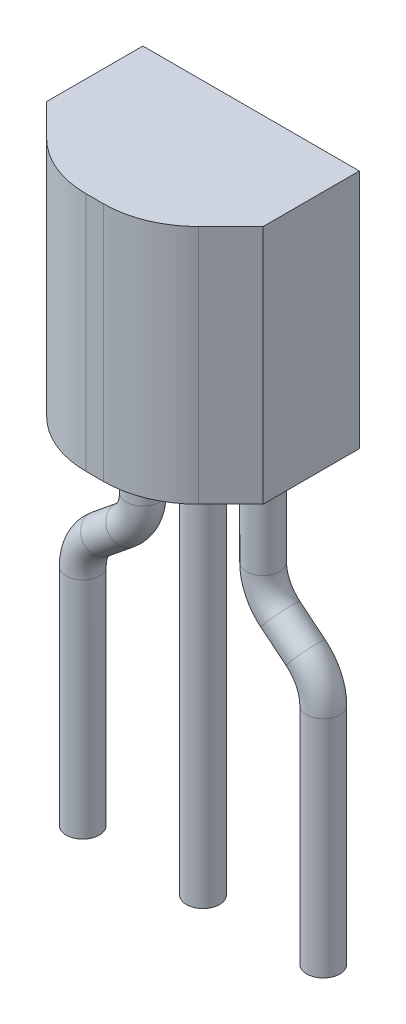
ISO-10303-21;
HEADER;
FILE_DESCRIPTION(('STEP AP214'),'2;1');
FILE_NAME('part.step','',(''),(''),'','','');
FILE_SCHEMA(('AUTOMOTIVE_DESIGN { 1 0 10303 214 1 1 1 1 }'));
ENDSEC;
DATA;
#1=APPLICATION_CONTEXT('core data for automotive mechanical design processes');
#2=APPLICATION_PROTOCOL_DEFINITION('international standard','automotive_design',2000,#1);
#3=PRODUCT_CONTEXT('',#1,'mechanical');
#4=PRODUCT('Part','Part','',(#3));
#5=PRODUCT_RELATED_PRODUCT_CATEGORY('part','',(#4));
#6=PRODUCT_DEFINITION_FORMATION('','',#4);
#7=PRODUCT_DEFINITION_CONTEXT('part definition',#1,'design');
#8=PRODUCT_DEFINITION('design','',#6,#7);
#9=PRODUCT_DEFINITION_SHAPE('','',#8);
#10=(LENGTH_UNIT() NAMED_UNIT(*) SI_UNIT(.MILLI.,.METRE.));
#11=(NAMED_UNIT(*) PLANE_ANGLE_UNIT() SI_UNIT($,.RADIAN.));
#12=(NAMED_UNIT(*) SI_UNIT($,.STERADIAN.) SOLID_ANGLE_UNIT());
#13=UNCERTAINTY_MEASURE_WITH_UNIT(LENGTH_MEASURE(1.E-05),#10,'distance_accuracy_value','');
#14=(GEOMETRIC_REPRESENTATION_CONTEXT(3) GLOBAL_UNCERTAINTY_ASSIGNED_CONTEXT((#13)) GLOBAL_UNIT_ASSIGNED_CONTEXT((#10,
#11,#12)) REPRESENTATION_CONTEXT('',''));
#15=CARTESIAN_POINT('',(0.,0.,0.));
#16=DIRECTION('',(0.,0.,1.));
#17=DIRECTION('',(1.,0.,0.));
#18=AXIS2_PLACEMENT_3D('',#15,#16,#17);
#19=CARTESIAN_POINT('',(-1.016,0.,-1.016));
#20=DIRECTION('',(0.,-1.,0.));
#21=DIRECTION('',(0.,0.,-1.));
#22=AXIS2_PLACEMENT_3D('',#19,#20,#21);
#23=PLANE('',#22);
#24=CARTESIAN_POINT('',(1.27,0.,0.));
#25=DIRECTION('',(0.,-1.,0.));
#26=DIRECTION('',(0.,0.,-1.));
#27=AXIS2_PLACEMENT_3D('',#24,#25,#26);
#28=CIRCLE('',#27,0.35);
#29=CARTESIAN_POINT('',(1.27,0.,-0.35));
#30=VERTEX_POINT('',#29);
#31=EDGE_CURVE('E211',#30,#30,#28,.T.);
#32=ORIENTED_EDGE('',*,*,#31,.F.);
#33=EDGE_LOOP('',(#32));
#34=FACE_BOUND('',#33,.T.);
#35=DIRECTION('',(0.707106781186547,0.,-0.707106781186547));
#36=VECTOR('',#35,1.);
#37=CARTESIAN_POINT('',(2.286,0.,2.286));
#38=LINE('',#37,#36);
#39=CARTESIAN_POINT('',(2.8717864376269,0.,1.70021356237309));
#40=VERTEX_POINT('',#39);
#41=CARTESIAN_POINT('',(3.556,0.,1.016));
#42=VERTEX_POINT('',#41);
#43=EDGE_CURVE('E181',#40,#42,#38,.T.);
#44=ORIENTED_EDGE('',*,*,#43,.F.);
#45=CARTESIAN_POINT('',(1.45757287525381,0.,0.286));
#46=DIRECTION('',(0.,-1.,0.));
#47=DIRECTION('',(0.,0.,-1.));
#48=AXIS2_PLACEMENT_3D('',#45,#46,#47);
#49=CIRCLE('',#48,2.);
#50=CARTESIAN_POINT('',(1.45757287525381,0.,2.286));
#51=VERTEX_POINT('',#50);
#52=EDGE_CURVE('E149',#40,#51,#49,.T.);
#53=ORIENTED_EDGE('',*,*,#52,.T.);
#54=DIRECTION('',(1.,0.,0.));
#55=VECTOR('',#54,1.);
#56=CARTESIAN_POINT('',(0.254,0.,2.286));
#57=LINE('',#56,#55);
#58=CARTESIAN_POINT('',(1.08242712474619,0.,2.286));
#59=VERTEX_POINT('',#58);
#60=EDGE_CURVE('E179',#59,#51,#57,.T.);
#61=ORIENTED_EDGE('',*,*,#60,.F.);
#62=CARTESIAN_POINT('',(1.08242712474619,0.,0.286));
#63=DIRECTION('',(0.,-1.,0.));
#64=DIRECTION('',(0.,0.,-1.));
#65=AXIS2_PLACEMENT_3D('',#62,#63,#64);
#66=CIRCLE('',#65,2.);
#67=CARTESIAN_POINT('',(-0.331786437626905,0.,1.70021356237309));
#68=VERTEX_POINT('',#67);
#69=EDGE_CURVE('E139',#59,#68,#66,.T.);
#70=ORIENTED_EDGE('',*,*,#69,.T.);
#71=DIRECTION('',(0.707106781186547,0.,0.707106781186547));
#72=VECTOR('',#71,1.);
#73=CARTESIAN_POINT('',(-1.016,0.,1.016));
#74=LINE('',#73,#72);
#75=CARTESIAN_POINT('',(-1.016,0.,1.016));
#76=VERTEX_POINT('',#75);
#77=EDGE_CURVE('E185',#76,#68,#74,.T.);
#78=ORIENTED_EDGE('',*,*,#77,.F.);
#79=DIRECTION('',(0.,0.,1.));
#80=VECTOR('',#79,1.);
#81=CARTESIAN_POINT('',(-1.016,0.,1.016));
#82=LINE('',#81,#80);
#83=CARTESIAN_POINT('',(-1.016,0.,-1.016));
#84=VERTEX_POINT('',#83);
#85=EDGE_CURVE('E131',#84,#76,#82,.T.);
#86=ORIENTED_EDGE('',*,*,#85,.F.);
#87=DIRECTION('',(-1.,0.,0.));
#88=VECTOR('',#87,1.);
#89=CARTESIAN_POINT('',(-1.016,0.,-1.016));
#90=LINE('',#89,#88);
#91=CARTESIAN_POINT('',(3.556,0.,-1.016));
#92=VERTEX_POINT('',#91);
#93=EDGE_CURVE('E127',#92,#84,#90,.T.);
#94=ORIENTED_EDGE('',*,*,#93,.F.);
#95=DIRECTION('',(0.,0.,-1.));
#96=VECTOR('',#95,1.);
#97=CARTESIAN_POINT('',(3.556,0.,1.016));
#98=LINE('',#97,#96);
#99=EDGE_CURVE('E187',#42,#92,#98,.T.);
#100=ORIENTED_EDGE('',*,*,#99,.F.);
#101=EDGE_LOOP('',(#44,#53,#61,#70,#78,#86,#94,#100));
#102=FACE_BOUND('',#101,.T.);
#103=CARTESIAN_POINT('',(0.,0.,0.));
#104=DIRECTION('',(0.,-1.,0.));
#105=DIRECTION('',(0.,0.,-1.));
#106=AXIS2_PLACEMENT_3D('',#103,#104,#105);
#107=CIRCLE('',#106,0.35);
#108=CARTESIAN_POINT('',(0.,0.,-0.35));
#109=VERTEX_POINT('',#108);
#110=EDGE_CURVE('E208',#109,#109,#107,.T.);
#111=ORIENTED_EDGE('',*,*,#110,.F.);
#112=EDGE_LOOP('',(#111));
#113=FACE_BOUND('',#112,.T.);
#114=CARTESIAN_POINT('',(2.54,0.,0.));
#115=DIRECTION('',(0.,-1.,0.));
#116=DIRECTION('',(0.,0.,-1.));
#117=AXIS2_PLACEMENT_3D('',#114,#115,#116);
#118=CIRCLE('',#117,0.35);
#119=CARTESIAN_POINT('',(2.54,0.,-0.35));
#120=VERTEX_POINT('',#119);
#121=EDGE_CURVE('E223',#120,#120,#118,.T.);
#122=ORIENTED_EDGE('',*,*,#121,.F.);
#123=EDGE_LOOP('',(#122));
#124=FACE_BOUND('',#123,.T.);
#125=ADVANCED_FACE('F42',(#34,#102,#113,#124),#23,.T.);
#126=CARTESIAN_POINT('',(-1.016,5.08,1.016));
#127=DIRECTION('',(1.,0.,0.));
#128=DIRECTION('',(0.,0.,-1.));
#129=AXIS2_PLACEMENT_3D('',#126,#127,#128);
#130=PLANE('',#129);
#131=ORIENTED_EDGE('',*,*,#85,.T.);
#132=DIRECTION('',(0.,-1.,0.));
#133=VECTOR('',#132,1.);
#134=CARTESIAN_POINT('',(-1.016,5.08,1.016));
#135=LINE('',#134,#133);
#136=CARTESIAN_POINT('',(-1.016,5.08,1.016));
#137=VERTEX_POINT('',#136);
#138=EDGE_CURVE('E111',#137,#76,#135,.T.);
#139=ORIENTED_EDGE('',*,*,#138,.F.);
#140=DIRECTION('',(0.,0.,1.));
#141=VECTOR('',#140,1.);
#142=CARTESIAN_POINT('',(-1.016,5.08,1.016));
#143=LINE('',#142,#141);
#144=CARTESIAN_POINT('',(-1.016,5.08,-1.016));
#145=VERTEX_POINT('',#144);
#146=EDGE_CURVE('E117',#145,#137,#143,.T.);
#147=ORIENTED_EDGE('',*,*,#146,.F.);
#148=DIRECTION('',(0.,-1.,0.));
#149=VECTOR('',#148,1.);
#150=CARTESIAN_POINT('',(-1.016,5.08,-1.016));
#151=LINE('',#150,#149);
#152=EDGE_CURVE('E197',#145,#84,#151,.T.);
#153=ORIENTED_EDGE('',*,*,#152,.T.);
#154=EDGE_LOOP('',(#131,#139,#147,#153));
#155=FACE_BOUND('',#154,.T.);
#156=ADVANCED_FACE('F129',(#155),#130,.F.);
#157=CARTESIAN_POINT('',(-1.016,5.08,1.016));
#158=DIRECTION('',(0.707106781186548,0.,-0.707106781186548));
#159=DIRECTION('',(-0.707106781186548,0.,-0.707106781186548));
#160=AXIS2_PLACEMENT_3D('',#157,#158,#159);
#161=PLANE('',#160);
#162=ORIENTED_EDGE('',*,*,#77,.T.);
#163=DIRECTION('',(0.,-1.,0.));
#164=VECTOR('',#163,1.);
#165=CARTESIAN_POINT('',(-0.331786437626905,5.08,1.70021356237309));
#166=LINE('',#165,#164);
#167=CARTESIAN_POINT('',(-0.331786437626905,5.08,1.70021356237309));
#168=VERTEX_POINT('',#167);
#169=EDGE_CURVE('E11',#68,#168,#166,.F.);
#170=ORIENTED_EDGE('',*,*,#169,.T.);
#171=DIRECTION('',(0.707106781186547,0.,0.707106781186547));
#172=VECTOR('',#171,1.);
#173=CARTESIAN_POINT('',(-1.016,5.08,1.016));
#174=LINE('',#173,#172);
#175=EDGE_CURVE('E107',#137,#168,#174,.T.);
#176=ORIENTED_EDGE('',*,*,#175,.F.);
#177=ORIENTED_EDGE('',*,*,#138,.T.);
#178=EDGE_LOOP('',(#162,#170,#176,#177));
#179=FACE_BOUND('',#178,.T.);
#180=ADVANCED_FACE('F109',(#179),#161,.F.);
#181=CARTESIAN_POINT('',(0.254,5.08,2.286));
#182=DIRECTION('',(0.,0.,-1.));
#183=DIRECTION('',(-1.,0.,0.));
#184=AXIS2_PLACEMENT_3D('',#181,#182,#183);
#185=PLANE('',#184);
#186=ORIENTED_EDGE('',*,*,#60,.T.);
#187=DIRECTION('',(0.,-1.,0.));
#188=VECTOR('',#187,1.);
#189=CARTESIAN_POINT('',(1.45757287525381,5.08,2.286));
#190=LINE('',#189,#188);
#191=CARTESIAN_POINT('',(1.45757287525381,5.08,2.286));
#192=VERTEX_POINT('',#191);
#193=EDGE_CURVE('E64',#51,#192,#190,.F.);
#194=ORIENTED_EDGE('',*,*,#193,.T.);
#195=DIRECTION('',(1.,0.,0.));
#196=VECTOR('',#195,1.);
#197=CARTESIAN_POINT('',(0.254,5.08,2.286));
#198=LINE('',#197,#196);
#199=CARTESIAN_POINT('',(1.08242712474619,5.08,2.286));
#200=VERTEX_POINT('',#199);
#201=EDGE_CURVE('E116',#200,#192,#198,.T.);
#202=ORIENTED_EDGE('',*,*,#201,.F.);
#203=DIRECTION('',(0.,-1.,0.));
#204=VECTOR('',#203,1.);
#205=CARTESIAN_POINT('',(1.08242712474619,5.08,2.286));
#206=LINE('',#205,#204);
#207=EDGE_CURVE('E152',#200,#59,#206,.T.);
#208=ORIENTED_EDGE('',*,*,#207,.T.);
#209=EDGE_LOOP('',(#186,#194,#202,#208));
#210=FACE_BOUND('',#209,.T.);
#211=ADVANCED_FACE('F182',(#210),#185,.F.);
#212=CARTESIAN_POINT('',(2.286,5.08,2.286));
#213=DIRECTION('',(-0.707106781186548,0.,-0.707106781186548));
#214=DIRECTION('',(-0.707106781186548,0.,0.707106781186548));
#215=AXIS2_PLACEMENT_3D('',#212,#213,#214);
#216=PLANE('',#215);
#217=DIRECTION('',(0.707106781186547,0.,-0.707106781186547));
#218=VECTOR('',#217,1.);
#219=CARTESIAN_POINT('',(2.286,5.08,2.286));
#220=LINE('',#219,#218);
#221=CARTESIAN_POINT('',(2.8717864376269,5.08,1.70021356237309));
#222=VERTEX_POINT('',#221);
#223=CARTESIAN_POINT('',(3.556,5.08,1.016));
#224=VERTEX_POINT('',#223);
#225=EDGE_CURVE('E164',#222,#224,#220,.T.);
#226=ORIENTED_EDGE('',*,*,#225,.F.);
#227=DIRECTION('',(0.,-1.,0.));
#228=VECTOR('',#227,1.);
#229=CARTESIAN_POINT('',(2.8717864376269,5.08,1.7002135623731));
#230=LINE('',#229,#228);
#231=EDGE_CURVE('E133',#222,#40,#230,.T.);
#232=ORIENTED_EDGE('',*,*,#231,.T.);
#233=ORIENTED_EDGE('',*,*,#43,.T.);
#234=DIRECTION('',(0.,-1.,0.));
#235=VECTOR('',#234,1.);
#236=CARTESIAN_POINT('',(3.556,5.08,1.016));
#237=LINE('',#236,#235);
#238=EDGE_CURVE('E134',#224,#42,#237,.T.);
#239=ORIENTED_EDGE('',*,*,#238,.F.);
#240=EDGE_LOOP('',(#226,#232,#233,#239));
#241=FACE_BOUND('',#240,.T.);
#242=ADVANCED_FACE('F169',(#241),#216,.F.);
#243=CARTESIAN_POINT('',(3.556,5.08,1.016));
#244=DIRECTION('',(-1.,0.,0.));
#245=DIRECTION('',(0.,0.,1.));
#246=AXIS2_PLACEMENT_3D('',#243,#244,#245);
#247=PLANE('',#246);
#248=ORIENTED_EDGE('',*,*,#99,.T.);
#249=DIRECTION('',(0.,-1.,0.));
#250=VECTOR('',#249,1.);
#251=CARTESIAN_POINT('',(3.556,5.08,-1.016));
#252=LINE('',#251,#250);
#253=CARTESIAN_POINT('',(3.556,5.08,-1.016));
#254=VERTEX_POINT('',#253);
#255=EDGE_CURVE('E143',#254,#92,#252,.T.);
#256=ORIENTED_EDGE('',*,*,#255,.F.);
#257=DIRECTION('',(0.,0.,-1.));
#258=VECTOR('',#257,1.);
#259=CARTESIAN_POINT('',(3.556,5.08,1.016));
#260=LINE('',#259,#258);
#261=EDGE_CURVE('E173',#224,#254,#260,.T.);
#262=ORIENTED_EDGE('',*,*,#261,.F.);
#263=ORIENTED_EDGE('',*,*,#238,.T.);
#264=EDGE_LOOP('',(#248,#256,#262,#263));
#265=FACE_BOUND('',#264,.T.);
#266=ADVANCED_FACE('F299',(#265),#247,.F.);
#267=CARTESIAN_POINT('',(-1.016,5.08,-1.016));
#268=DIRECTION('',(0.,0.,1.));
#269=DIRECTION('',(1.,0.,0.));
#270=AXIS2_PLACEMENT_3D('',#267,#268,#269);
#271=PLANE('',#270);
#272=ORIENTED_EDGE('',*,*,#93,.T.);
#273=ORIENTED_EDGE('',*,*,#152,.F.);
#274=DIRECTION('',(-1.,0.,0.));
#275=VECTOR('',#274,1.);
#276=CARTESIAN_POINT('',(-1.016,5.08,-1.016));
#277=LINE('',#276,#275);
#278=EDGE_CURVE('E122',#254,#145,#277,.T.);
#279=ORIENTED_EDGE('',*,*,#278,.F.);
#280=ORIENTED_EDGE('',*,*,#255,.T.);
#281=EDGE_LOOP('',(#272,#273,#279,#280));
#282=FACE_BOUND('',#281,.T.);
#283=ADVANCED_FACE('F205',(#282),#271,.F.);
#284=CARTESIAN_POINT('',(-1.016,5.08,-1.016));
#285=DIRECTION('',(0.,-1.,0.));
#286=DIRECTION('',(0.,0.,-1.));
#287=AXIS2_PLACEMENT_3D('',#284,#285,#286);
#288=PLANE('',#287);
#289=ORIENTED_EDGE('',*,*,#201,.T.);
#290=CARTESIAN_POINT('',(1.45757287525381,5.08,0.286));
#291=DIRECTION('',(0.,-1.,0.));
#292=DIRECTION('',(0.,0.,-1.));
#293=AXIS2_PLACEMENT_3D('',#290,#291,#292);
#294=CIRCLE('',#293,2.);
#295=EDGE_CURVE('E51',#192,#222,#294,.F.);
#296=ORIENTED_EDGE('',*,*,#295,.T.);
#297=ORIENTED_EDGE('',*,*,#225,.T.);
#298=ORIENTED_EDGE('',*,*,#261,.T.);
#299=ORIENTED_EDGE('',*,*,#278,.T.);
#300=ORIENTED_EDGE('',*,*,#146,.T.);
#301=ORIENTED_EDGE('',*,*,#175,.T.);
#302=CARTESIAN_POINT('',(1.08242712474619,5.08,0.286));
#303=DIRECTION('',(0.,-1.,0.));
#304=DIRECTION('',(0.,0.,-1.));
#305=AXIS2_PLACEMENT_3D('',#302,#303,#304);
#306=CIRCLE('',#305,2.);
#307=EDGE_CURVE('E158',#168,#200,#306,.F.);
#308=ORIENTED_EDGE('',*,*,#307,.T.);
#309=EDGE_LOOP('',(#289,#296,#297,#298,#299,#300,#301,#308));
#310=FACE_BOUND('',#309,.T.);
#311=ADVANCED_FACE('F120',(#310),#288,.F.);
#312=CARTESIAN_POINT('',(0.,-2.,0.));
#313=DIRECTION('',(0.,1.,0.));
#314=DIRECTION('',(0.,0.,1.));
#315=AXIS2_PLACEMENT_3D('',#312,#313,#314);
#316=CYLINDRICAL_SURFACE('',#315,0.35);
#317=ORIENTED_EDGE('',*,*,#110,.T.);
#318=EDGE_LOOP('',(#317));
#319=FACE_BOUND('',#318,.T.);
#320=CARTESIAN_POINT('',(0.,-2.07444920077192,0.));
#321=DIRECTION('',(0.,1.,0.));
#322=DIRECTION('',(0.,0.,-1.));
#323=AXIS2_PLACEMENT_3D('',#320,#321,#322);
#324=CIRCLE('',#323,0.35);
#325=CARTESIAN_POINT('',(0.35,-2.07444920077191,0.));
#326=VERTEX_POINT('',#325);
#327=EDGE_CURVE('E249',#326,#326,#324,.F.);
#328=ORIENTED_EDGE('',*,*,#327,.F.);
#329=EDGE_LOOP('',(#328));
#330=FACE_BOUND('',#329,.T.);
#331=ADVANCED_FACE('F321',(#319,#330),#316,.T.);
#332=CARTESIAN_POINT('',(1.27,-2.,0.));
#333=DIRECTION('',(0.,1.,0.));
#334=DIRECTION('',(0.,0.,1.));
#335=AXIS2_PLACEMENT_3D('',#332,#333,#334);
#336=CYLINDRICAL_SURFACE('',#335,0.35);
#337=ORIENTED_EDGE('',*,*,#31,.T.);
#338=EDGE_LOOP('',(#337));
#339=FACE_BOUND('',#338,.T.);
#340=CARTESIAN_POINT('',(1.27,-8.8,0.));
#341=DIRECTION('',(0.,-1.,0.));
#342=DIRECTION('',(0.,0.,-1.));
#343=AXIS2_PLACEMENT_3D('',#340,#341,#342);
#344=CIRCLE('',#343,0.35);
#345=CARTESIAN_POINT('',(1.27,-8.8,-0.35));
#346=VERTEX_POINT('',#345);
#347=EDGE_CURVE('E227',#346,#346,#344,.T.);
#348=ORIENTED_EDGE('',*,*,#347,.F.);
#349=EDGE_LOOP('',(#348));
#350=FACE_BOUND('',#349,.T.);
#351=ADVANCED_FACE('F315',(#339,#350),#336,.T.);
#352=CARTESIAN_POINT('',(2.54,-2.,0.));
#353=DIRECTION('',(0.,1.,0.));
#354=DIRECTION('',(0.,0.,1.));
#355=AXIS2_PLACEMENT_3D('',#352,#353,#354);
#356=CYLINDRICAL_SURFACE('',#355,0.35);
#357=ORIENTED_EDGE('',*,*,#121,.T.);
#358=EDGE_LOOP('',(#357));
#359=FACE_BOUND('',#358,.T.);
#360=CARTESIAN_POINT('',(2.54000000000003,-2.07444920077191,0.));
#361=DIRECTION('',(0.,-1.,0.));
#362=DIRECTION('',(0.,0.,-1.));
#363=AXIS2_PLACEMENT_3D('',#360,#361,#362);
#364=CIRCLE('',#363,0.35);
#365=CARTESIAN_POINT('',(2.19,-2.0744492007719,0.));
#366=VERTEX_POINT('',#365);
#367=EDGE_CURVE('E231',#366,#366,#364,.T.);
#368=ORIENTED_EDGE('',*,*,#367,.F.);
#369=EDGE_LOOP('',(#368));
#370=FACE_BOUND('',#369,.T.);
#371=ADVANCED_FACE('F308',(#359,#370),#356,.T.);
#372=CARTESIAN_POINT('',(1.45757287525381,5.08,0.286));
#373=DIRECTION('',(0.,-1.,0.));
#374=DIRECTION('',(0.,0.,-1.));
#375=AXIS2_PLACEMENT_3D('',#372,#373,#374);
#376=CYLINDRICAL_SURFACE('',#375,2.);
#377=ORIENTED_EDGE('',*,*,#295,.F.);
#378=ORIENTED_EDGE('',*,*,#193,.F.);
#379=ORIENTED_EDGE('',*,*,#52,.F.);
#380=ORIENTED_EDGE('',*,*,#231,.F.);
#381=EDGE_LOOP('',(#377,#378,#379,#380));
#382=FACE_BOUND('',#381,.T.);
#383=ADVANCED_FACE('F175',(#382),#376,.T.);
#384=CARTESIAN_POINT('',(1.08242712474619,5.08,0.286));
#385=DIRECTION('',(0.,-1.,0.));
#386=DIRECTION('',(0.,0.,-1.));
#387=AXIS2_PLACEMENT_3D('',#384,#385,#386);
#388=CYLINDRICAL_SURFACE('',#387,2.);
#389=ORIENTED_EDGE('',*,*,#307,.F.);
#390=ORIENTED_EDGE('',*,*,#169,.F.);
#391=ORIENTED_EDGE('',*,*,#69,.F.);
#392=ORIENTED_EDGE('',*,*,#207,.F.);
#393=EDGE_LOOP('',(#389,#390,#391,#392));
#394=FACE_BOUND('',#393,.T.);
#395=ADVANCED_FACE('F44',(#394),#388,.T.);
#396=CARTESIAN_POINT('',(1.27,-8.8,0.));
#397=DIRECTION('',(0.,-1.,0.));
#398=DIRECTION('',(0.,0.,-1.));
#399=AXIS2_PLACEMENT_3D('',#396,#397,#398);
#400=PLANE('',#399);
#401=ORIENTED_EDGE('',*,*,#347,.T.);
#402=EDGE_LOOP('',(#401));
#403=FACE_BOUND('',#402,.T.);
#404=ADVANCED_FACE('F313',(#403),#400,.T.);
#405=CARTESIAN_POINT('',(3.81,-8.8,0.));
#406=DIRECTION('',(0.,-1.,0.));
#407=DIRECTION('',(0.,0.,-1.));
#408=AXIS2_PLACEMENT_3D('',#405,#406,#407);
#409=PLANE('',#408);
#410=CARTESIAN_POINT('',(3.81,-8.8,0.));
#411=DIRECTION('',(0.,-1.,0.));
#412=DIRECTION('',(0.,0.,-1.));
#413=AXIS2_PLACEMENT_3D('',#410,#411,#412);
#414=CIRCLE('',#413,0.35);
#415=CARTESIAN_POINT('',(3.81,-8.8,-0.35));
#416=VERTEX_POINT('',#415);
#417=EDGE_CURVE('E245',#416,#416,#414,.T.);
#418=ORIENTED_EDGE('',*,*,#417,.T.);
#419=EDGE_LOOP('',(#418));
#420=FACE_BOUND('',#419,.T.);
#421=ADVANCED_FACE('F340',(#420),#409,.T.);
#422=CARTESIAN_POINT('',(3.81,-8.8,0.));
#423=DIRECTION('',(0.,1.,0.));
#424=DIRECTION('',(0.,0.,1.));
#425=AXIS2_PLACEMENT_3D('',#422,#423,#424);
#426=CYLINDRICAL_SURFACE('',#425,0.35);
#427=CARTESIAN_POINT('',(3.81,-4.05936096665577,0.));
#428=DIRECTION('',(0.,-1.,0.));
#429=DIRECTION('',(0.,0.,-1.));
#430=AXIS2_PLACEMENT_3D('',#427,#428,#429);
#431=CIRCLE('',#430,0.35);
#432=CARTESIAN_POINT('',(4.16,-4.05936096665577,0.));
#433=VERTEX_POINT('',#432);
#434=EDGE_CURVE('E241',#433,#433,#431,.T.);
#435=ORIENTED_EDGE('',*,*,#434,.T.);
#436=EDGE_LOOP('',(#435));
#437=FACE_BOUND('',#436,.T.);
#438=ORIENTED_EDGE('',*,*,#417,.F.);
#439=EDGE_LOOP('',(#438));
#440=FACE_BOUND('',#439,.T.);
#441=ADVANCED_FACE('F352',(#437,#440),#426,.T.);
#442=CARTESIAN_POINT('',(2.81,-4.05936096665577,0.));
#443=DIRECTION('',(0.,0.,1.));
#444=DIRECTION('',(1.,0.,0.));
#445=AXIS2_PLACEMENT_3D('',#442,#443,#444);
#446=TOROIDAL_SURFACE('',#445,1.,0.35);
#447=CARTESIAN_POINT('',(3.44155379463947,-3.28402890587375,0.));
#448=DIRECTION('',(0.775332060782014,-0.631553794639471,0.));
#449=DIRECTION('',(0.,0.,-1.));
#450=AXIS2_PLACEMENT_3D('',#447,#448,#449);
#451=CIRCLE('',#450,0.35);
#452=CARTESIAN_POINT('',(3.66259762276329,-3.01266268460005,0.));
#453=VERTEX_POINT('',#452);
#454=EDGE_CURVE('E237',#453,#453,#451,.T.);
#455=CARTESIAN_POINT('',(2.81,-4.05936096665577,0.));
#456=DIRECTION('',(0.,0.,1.));
#457=DIRECTION('',(1.,0.,0.));
#458=AXIS2_PLACEMENT_3D('',#455,#456,#457);
#459=CIRCLE('',#458,1.35);
#460=EDGE_CURVE('',#433,#453,#459,.T.);
#461=ORIENTED_EDGE('',*,*,#434,.F.);
#462=ORIENTED_EDGE('',*,*,#454,.T.);
#463=ORIENTED_EDGE('',*,*,#460,.T.);
#464=ORIENTED_EDGE('',*,*,#460,.F.);
#465=EDGE_LOOP('',(#461,#463,#462,#464));
#466=FACE_BOUND('',#465,.T.);
#467=ADVANCED_FACE('F355',(#466),#446,.T.);
#468=CARTESIAN_POINT('',(3.44155379463947,-3.28402890587375,0.));
#469=DIRECTION('',(-0.775332060782015,0.63155379463947,0.));
#470=DIRECTION('',(-0.63155379463947,-0.775332060782015,0.));
#471=AXIS2_PLACEMENT_3D('',#468,#469,#470);
#472=CYLINDRICAL_SURFACE('',#471,0.35);
#473=CARTESIAN_POINT('',(2.90844620536053,-2.84978126155394,0.));
#474=DIRECTION('',(0.775332060782015,-0.63155379463947,0.));
#475=DIRECTION('',(0.,0.,-1.));
#476=AXIS2_PLACEMENT_3D('',#473,#474,#475);
#477=CIRCLE('',#476,0.35);
#478=CARTESIAN_POINT('',(2.68740237723672,-3.12114748282765,0.));
#479=VERTEX_POINT('',#478);
#480=EDGE_CURVE('E234',#479,#479,#477,.T.);
#481=ORIENTED_EDGE('',*,*,#480,.T.);
#482=EDGE_LOOP('',(#481));
#483=FACE_BOUND('',#482,.T.);
#484=ORIENTED_EDGE('',*,*,#454,.F.);
#485=EDGE_LOOP('',(#484));
#486=FACE_BOUND('',#485,.T.);
#487=ADVANCED_FACE('F359',(#483,#486),#472,.T.);
#488=CARTESIAN_POINT('',(3.54,-2.07444920077192,0.));
#489=DIRECTION('',(0.,0.,-1.));
#490=DIRECTION('',(-1.,0.,0.));
#491=AXIS2_PLACEMENT_3D('',#488,#489,#490);
#492=TOROIDAL_SURFACE('',#491,1.,0.35);
#493=CARTESIAN_POINT('',(3.54,-2.07444920077192,0.));
#494=DIRECTION('',(0.,0.,-1.));
#495=DIRECTION('',(-1.,0.,0.));
#496=AXIS2_PLACEMENT_3D('',#493,#494,#495);
#497=CIRCLE('',#496,1.35);
#498=EDGE_CURVE('',#479,#366,#497,.T.);
#499=ORIENTED_EDGE('',*,*,#480,.F.);
#500=ORIENTED_EDGE('',*,*,#367,.T.);
#501=ORIENTED_EDGE('',*,*,#498,.T.);
#502=ORIENTED_EDGE('',*,*,#498,.F.);
#503=EDGE_LOOP('',(#499,#501,#500,#502));
#504=FACE_BOUND('',#503,.T.);
#505=ADVANCED_FACE('F284',(#504),#492,.T.);
#506=CARTESIAN_POINT('',(-1.27,-8.8,0.));
#507=DIRECTION('',(0.,-1.,0.));
#508=DIRECTION('',(0.,0.,-1.));
#509=AXIS2_PLACEMENT_3D('',#506,#507,#508);
#510=PLANE('',#509);
#511=CARTESIAN_POINT('',(-1.27,-8.8,0.));
#512=DIRECTION('',(0.,1.,0.));
#513=DIRECTION('',(0.,0.,-1.));
#514=AXIS2_PLACEMENT_3D('',#511,#512,#513);
#515=CIRCLE('',#514,0.35);
#516=CARTESIAN_POINT('',(-1.27,-8.8,-0.35));
#517=VERTEX_POINT('',#516);
#518=EDGE_CURVE('E265',#517,#517,#515,.F.);
#519=ORIENTED_EDGE('',*,*,#518,.T.);
#520=EDGE_LOOP('',(#519));
#521=FACE_BOUND('',#520,.T.);
#522=ADVANCED_FACE('F270',(#521),#510,.T.);
#523=CARTESIAN_POINT('',(-1.27,-8.8,0.));
#524=DIRECTION('',(0.,1.,0.));
#525=DIRECTION('',(0.,0.,1.));
#526=AXIS2_PLACEMENT_3D('',#523,#524,#525);
#527=CYLINDRICAL_SURFACE('',#526,0.35);
#528=CARTESIAN_POINT('',(-1.27,-4.05936096665577,0.));
#529=DIRECTION('',(0.,1.,0.));
#530=DIRECTION('',(0.,0.,-1.));
#531=AXIS2_PLACEMENT_3D('',#528,#529,#530);
#532=CIRCLE('',#531,0.35);
#533=CARTESIAN_POINT('',(-1.62,-4.05936096665577,0.));
#534=VERTEX_POINT('',#533);
#535=EDGE_CURVE('E261',#534,#534,#532,.F.);
#536=ORIENTED_EDGE('',*,*,#535,.T.);
#537=EDGE_LOOP('',(#536));
#538=FACE_BOUND('',#537,.T.);
#539=ORIENTED_EDGE('',*,*,#518,.F.);
#540=EDGE_LOOP('',(#539));
#541=FACE_BOUND('',#540,.T.);
#542=ADVANCED_FACE('F272',(#538,#541),#527,.T.);
#543=CARTESIAN_POINT('',(-0.27,-4.05936096665577,0.));
#544=DIRECTION('',(0.,0.,-1.));
#545=DIRECTION('',(-1.,0.,0.));
#546=AXIS2_PLACEMENT_3D('',#543,#544,#545);
#547=TOROIDAL_SURFACE('',#546,1.,0.35);
#548=CARTESIAN_POINT('',(-0.901553794639471,-3.28402890587375,0.));
#549=DIRECTION('',(0.775332060782014,0.631553794639471,0.));
#550=DIRECTION('',(0.,0.,-1.));
#551=AXIS2_PLACEMENT_3D('',#548,#549,#550);
#552=CIRCLE('',#551,0.35);
#553=CARTESIAN_POINT('',(-1.12259762276329,-3.01266268460005,0.));
#554=VERTEX_POINT('',#553);
#555=EDGE_CURVE('E257',#554,#554,#552,.F.);
#556=CARTESIAN_POINT('',(-0.27,-4.05936096665577,0.));
#557=DIRECTION('',(0.,0.,-1.));
#558=DIRECTION('',(-1.,0.,0.));
#559=AXIS2_PLACEMENT_3D('',#556,#557,#558);
#560=CIRCLE('',#559,1.35);
#561=EDGE_CURVE('',#534,#554,#560,.T.);
#562=ORIENTED_EDGE('',*,*,#535,.F.);
#563=ORIENTED_EDGE('',*,*,#555,.T.);
#564=ORIENTED_EDGE('',*,*,#561,.T.);
#565=ORIENTED_EDGE('',*,*,#561,.F.);
#566=EDGE_LOOP('',(#562,#564,#563,#565));
#567=FACE_BOUND('',#566,.T.);
#568=ADVANCED_FACE('F274',(#567),#547,.T.);
#569=CARTESIAN_POINT('',(-0.901553794639471,-3.28402890587375,0.));
#570=DIRECTION('',(0.775332060782015,0.63155379463947,0.));
#571=DIRECTION('',(-0.63155379463947,0.775332060782015,0.));
#572=AXIS2_PLACEMENT_3D('',#569,#570,#571);
#573=CYLINDRICAL_SURFACE('',#572,0.35);
#574=CARTESIAN_POINT('',(-0.368446205360532,-2.84978126155394,0.));
#575=DIRECTION('',(0.775332060782015,0.63155379463947,0.));
#576=DIRECTION('',(0.,0.,-1.));
#577=AXIS2_PLACEMENT_3D('',#574,#575,#576);
#578=CIRCLE('',#577,0.35);
#579=CARTESIAN_POINT('',(-0.147402377236719,-3.12114748282765,0.));
#580=VERTEX_POINT('',#579);
#581=EDGE_CURVE('E253',#580,#580,#578,.F.);
#582=ORIENTED_EDGE('',*,*,#581,.T.);
#583=EDGE_LOOP('',(#582));
#584=FACE_BOUND('',#583,.T.);
#585=ORIENTED_EDGE('',*,*,#555,.F.);
#586=EDGE_LOOP('',(#585));
#587=FACE_BOUND('',#586,.T.);
#588=ADVANCED_FACE('F281',(#584,#587),#573,.T.);
#589=CARTESIAN_POINT('',(-1.,-2.07444920077192,0.));
#590=DIRECTION('',(0.,0.,1.));
#591=DIRECTION('',(1.,0.,0.));
#592=AXIS2_PLACEMENT_3D('',#589,#590,#591);
#593=TOROIDAL_SURFACE('',#592,1.,0.35);
#594=CARTESIAN_POINT('',(-1.,-2.07444920077192,0.));
#595=DIRECTION('',(0.,0.,1.));
#596=DIRECTION('',(1.,0.,0.));
#597=AXIS2_PLACEMENT_3D('',#594,#595,#596);
#598=CIRCLE('',#597,1.35);
#599=EDGE_CURVE('',#580,#326,#598,.T.);
#600=ORIENTED_EDGE('',*,*,#581,.F.);
#601=ORIENTED_EDGE('',*,*,#327,.T.);
#602=ORIENTED_EDGE('',*,*,#599,.T.);
#603=ORIENTED_EDGE('',*,*,#599,.F.);
#604=EDGE_LOOP('',(#600,#602,#601,#603));
#605=FACE_BOUND('',#604,.T.);
#606=ADVANCED_FACE('F336',(#605),#593,.T.);
#607=CLOSED_SHELL('',(#125,#156,#180,#211,#242,#266,#283,#311,#331,#351,#371,#383,#395,#404,
#421,#441,#467,#487,#505,#522,#542,#568,#588,#606));
#608=MANIFOLD_SOLID_BREP('B2',#607);
#609=ADVANCED_BREP_SHAPE_REPRESENTATION('',(#18,#608),#14);
#610=SHAPE_DEFINITION_REPRESENTATION(#9,#609);
ENDSEC;
END-ISO-10303-21;
